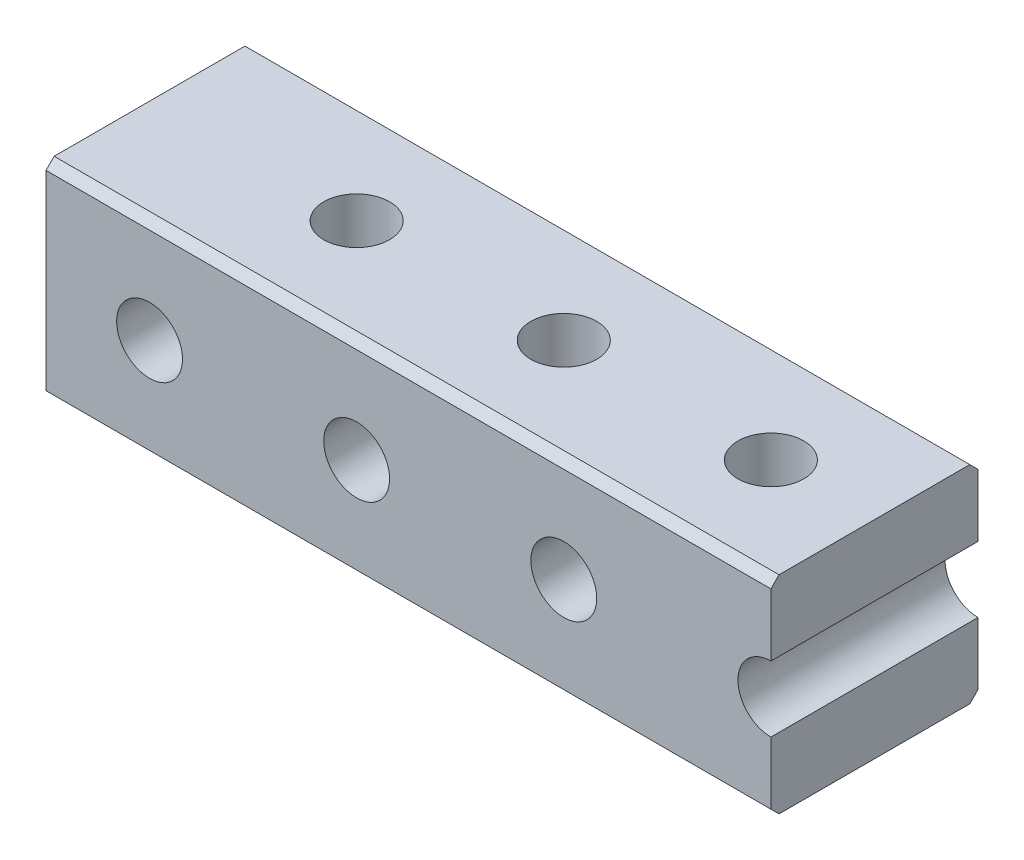
ISO-10303-21;
HEADER;
FILE_DESCRIPTION(('STEP AP214'),'2;1');
FILE_NAME('part.step','',(''),(''),'','','');
FILE_SCHEMA(('AUTOMOTIVE_DESIGN { 1 0 10303 214 1 1 1 1 }'));
ENDSEC;
DATA;
#1=APPLICATION_CONTEXT('core data for automotive mechanical design processes');
#2=APPLICATION_PROTOCOL_DEFINITION('international standard','automotive_design',2000,#1);
#3=PRODUCT_CONTEXT('',#1,'mechanical');
#4=PRODUCT('Part','Part','',(#3));
#5=PRODUCT_RELATED_PRODUCT_CATEGORY('part','',(#4));
#6=PRODUCT_DEFINITION_FORMATION('','',#4);
#7=PRODUCT_DEFINITION_CONTEXT('part definition',#1,'design');
#8=PRODUCT_DEFINITION('design','',#6,#7);
#9=PRODUCT_DEFINITION_SHAPE('','',#8);
#10=(LENGTH_UNIT() NAMED_UNIT(*) SI_UNIT(.MILLI.,.METRE.));
#11=(NAMED_UNIT(*) PLANE_ANGLE_UNIT() SI_UNIT($,.RADIAN.));
#12=(NAMED_UNIT(*) SI_UNIT($,.STERADIAN.) SOLID_ANGLE_UNIT());
#13=UNCERTAINTY_MEASURE_WITH_UNIT(LENGTH_MEASURE(1.E-05),#10,'distance_accuracy_value','');
#14=(GEOMETRIC_REPRESENTATION_CONTEXT(3) GLOBAL_UNCERTAINTY_ASSIGNED_CONTEXT((#13)) GLOBAL_UNIT_ASSIGNED_CONTEXT((#10,
#11,#12)) REPRESENTATION_CONTEXT('',''));
#15=CARTESIAN_POINT('',(0.,0.,0.));
#16=DIRECTION('',(0.,0.,1.));
#17=DIRECTION('',(1.,0.,0.));
#18=AXIS2_PLACEMENT_3D('',#15,#16,#17);
#19=CARTESIAN_POINT('',(22.225,0.,0.));
#20=DIRECTION('',(1.,0.,0.));
#21=DIRECTION('',(0.,1.,0.));
#22=AXIS2_PLACEMENT_3D('',#19,#20,#21);
#23=PLANE('',#22);
#24=DIRECTION('',(0.,0.,-1.));
#25=VECTOR('',#24,1.);
#26=CARTESIAN_POINT('',(22.225,-2.0193,6.35));
#27=LINE('',#26,#25);
#28=CARTESIAN_POINT('',(22.225,-2.0193,6.35));
#29=VERTEX_POINT('',#28);
#30=CARTESIAN_POINT('',(22.225,-2.0193,-6.35));
#31=VERTEX_POINT('',#30);
#32=EDGE_CURVE('E11',#29,#31,#27,.T.);
#33=ORIENTED_EDGE('',*,*,#32,.F.);
#34=DIRECTION('',(0.,1.,0.));
#35=VECTOR('',#34,1.);
#36=CARTESIAN_POINT('',(22.225,2.925,6.35));
#37=LINE('',#36,#35);
#38=CARTESIAN_POINT('',(22.225,-5.85,6.35));
#39=VERTEX_POINT('',#38);
#40=EDGE_CURVE('E204',#39,#29,#37,.T.);
#41=ORIENTED_EDGE('',*,*,#40,.F.);
#42=DIRECTION('',(0.,0.707106781186548,0.707106781186547));
#43=VECTOR('',#42,1.);
#44=CARTESIAN_POINT('',(22.225,-6.1,6.1));
#45=LINE('',#44,#43);
#46=CARTESIAN_POINT('',(22.225,-6.35,5.85));
#47=VERTEX_POINT('',#46);
#48=EDGE_CURVE('E200',#47,#39,#45,.T.);
#49=ORIENTED_EDGE('',*,*,#48,.F.);
#50=DIRECTION('',(0.,0.,1.));
#51=VECTOR('',#50,1.);
#52=CARTESIAN_POINT('',(22.225,-6.35,2.925));
#53=LINE('',#52,#51);
#54=CARTESIAN_POINT('',(22.225,-6.35,-5.85));
#55=VERTEX_POINT('',#54);
#56=EDGE_CURVE('E196',#55,#47,#53,.T.);
#57=ORIENTED_EDGE('',*,*,#56,.F.);
#58=DIRECTION('',(0.,-0.707106781186547,0.707106781186548));
#59=VECTOR('',#58,1.);
#60=CARTESIAN_POINT('',(22.225,-6.1,-6.1));
#61=LINE('',#60,#59);
#62=CARTESIAN_POINT('',(22.225,-5.85,-6.35));
#63=VERTEX_POINT('',#62);
#64=EDGE_CURVE('E192',#63,#55,#61,.T.);
#65=ORIENTED_EDGE('',*,*,#64,.F.);
#66=DIRECTION('',(0.,-1.,0.));
#67=VECTOR('',#66,1.);
#68=CARTESIAN_POINT('',(22.225,-2.925,-6.35));
#69=LINE('',#68,#67);
#70=EDGE_CURVE('E191',#31,#63,#69,.T.);
#71=ORIENTED_EDGE('',*,*,#70,.F.);
#72=EDGE_LOOP('',(#33,#41,#49,#57,#65,#71));
#73=FACE_BOUND('',#72,.T.);
#74=ADVANCED_FACE('F17',(#73),#23,.T.);
#75=CARTESIAN_POINT('',(130.175,6.1,-6.1));
#76=DIRECTION('',(0.,0.707106781186547,-0.707106781186548));
#77=DIRECTION('',(0.,0.707106781186548,0.707106781186547));
#78=AXIS2_PLACEMENT_3D('',#75,#76,#77);
#79=PLANE('',#78);
#80=DIRECTION('',(0.,-0.707106781186548,-0.707106781186547));
#81=VECTOR('',#80,1.);
#82=CARTESIAN_POINT('',(-22.225,6.1,-6.1));
#83=LINE('',#82,#81);
#84=CARTESIAN_POINT('',(-22.225,6.35,-5.85));
#85=VERTEX_POINT('',#84);
#86=CARTESIAN_POINT('',(-22.225,5.85,-6.35));
#87=VERTEX_POINT('',#86);
#88=EDGE_CURVE('E108',#85,#87,#83,.T.);
#89=ORIENTED_EDGE('',*,*,#88,.F.);
#90=DIRECTION('',(-1.,0.,0.));
#91=VECTOR('',#90,1.);
#92=CARTESIAN_POINT('',(130.175,6.35,-5.85));
#93=LINE('',#92,#91);
#94=CARTESIAN_POINT('',(22.225,6.35,-5.85));
#95=VERTEX_POINT('',#94);
#96=EDGE_CURVE('E93',#95,#85,#93,.T.);
#97=ORIENTED_EDGE('',*,*,#96,.F.);
#98=DIRECTION('',(0.,-0.707106781186548,-0.707106781186547));
#99=VECTOR('',#98,1.);
#100=CARTESIAN_POINT('',(22.225,6.1,-6.1));
#101=LINE('',#100,#99);
#102=CARTESIAN_POINT('',(22.225,5.85,-6.35));
#103=VERTEX_POINT('',#102);
#104=EDGE_CURVE('E148',#95,#103,#101,.T.);
#105=ORIENTED_EDGE('',*,*,#104,.T.);
#106=DIRECTION('',(-1.,0.,0.));
#107=VECTOR('',#106,1.);
#108=CARTESIAN_POINT('',(130.175,5.85,-6.35));
#109=LINE('',#108,#107);
#110=EDGE_CURVE('E110',#103,#87,#109,.T.);
#111=ORIENTED_EDGE('',*,*,#110,.T.);
#112=EDGE_LOOP('',(#89,#97,#105,#111));
#113=FACE_BOUND('',#112,.T.);
#114=ADVANCED_FACE('F109',(#113),#79,.T.);
#115=CARTESIAN_POINT('',(130.175,6.35,-2.925));
#116=DIRECTION('',(0.,1.,0.));
#117=DIRECTION('',(0.,0.,1.));
#118=AXIS2_PLACEMENT_3D('',#115,#116,#117);
#119=PLANE('',#118);
#120=CARTESIAN_POINT('',(-9.525,6.35,0.));
#121=DIRECTION('',(0.,1.,0.));
#122=DIRECTION('',(0.,0.,1.));
#123=AXIS2_PLACEMENT_3D('',#120,#121,#122);
#124=CIRCLE('',#123,2.0193);
#125=CARTESIAN_POINT('',(-9.525,6.35,2.0193));
#126=VERTEX_POINT('',#125);
#127=EDGE_CURVE('E115',#126,#126,#124,.F.);
#128=ORIENTED_EDGE('',*,*,#127,.T.);
#129=EDGE_LOOP('',(#128));
#130=FACE_BOUND('',#129,.T.);
#131=CARTESIAN_POINT('',(3.175,6.35,0.));
#132=DIRECTION('',(0.,1.,0.));
#133=DIRECTION('',(0.,0.,1.));
#134=AXIS2_PLACEMENT_3D('',#131,#132,#133);
#135=CIRCLE('',#134,2.0193);
#136=CARTESIAN_POINT('',(3.175,6.35,2.0193));
#137=VERTEX_POINT('',#136);
#138=EDGE_CURVE('E236',#137,#137,#135,.F.);
#139=ORIENTED_EDGE('',*,*,#138,.T.);
#140=EDGE_LOOP('',(#139));
#141=FACE_BOUND('',#140,.T.);
#142=CARTESIAN_POINT('',(15.875,6.35,0.));
#143=DIRECTION('',(0.,1.,0.));
#144=DIRECTION('',(0.,0.,1.));
#145=AXIS2_PLACEMENT_3D('',#142,#143,#144);
#146=CIRCLE('',#145,2.0193);
#147=CARTESIAN_POINT('',(15.875,6.35,2.0193));
#148=VERTEX_POINT('',#147);
#149=EDGE_CURVE('E233',#148,#148,#146,.F.);
#150=ORIENTED_EDGE('',*,*,#149,.T.);
#151=EDGE_LOOP('',(#150));
#152=FACE_BOUND('',#151,.T.);
#153=DIRECTION('',(0.,0.,-1.));
#154=VECTOR('',#153,1.);
#155=CARTESIAN_POINT('',(-22.225,6.35,-2.925));
#156=LINE('',#155,#154);
#157=CARTESIAN_POINT('',(-22.225,6.35,5.85));
#158=VERTEX_POINT('',#157);
#159=EDGE_CURVE('E97',#158,#85,#156,.T.);
#160=ORIENTED_EDGE('',*,*,#159,.F.);
#161=DIRECTION('',(-1.,0.,0.));
#162=VECTOR('',#161,1.);
#163=CARTESIAN_POINT('',(130.175,6.35,5.85));
#164=LINE('',#163,#162);
#165=CARTESIAN_POINT('',(22.225,6.35,5.85));
#166=VERTEX_POINT('',#165);
#167=EDGE_CURVE('E105',#166,#158,#164,.T.);
#168=ORIENTED_EDGE('',*,*,#167,.F.);
#169=DIRECTION('',(0.,0.,-1.));
#170=VECTOR('',#169,1.);
#171=CARTESIAN_POINT('',(22.225,6.35,-2.925));
#172=LINE('',#171,#170);
#173=EDGE_CURVE('E100',#166,#95,#172,.T.);
#174=ORIENTED_EDGE('',*,*,#173,.T.);
#175=ORIENTED_EDGE('',*,*,#96,.T.);
#176=EDGE_LOOP('',(#160,#168,#174,#175));
#177=FACE_BOUND('',#176,.T.);
#178=ADVANCED_FACE('F95',(#130,#141,#152,#177),#119,.T.);
#179=CARTESIAN_POINT('',(130.175,6.1,6.1));
#180=DIRECTION('',(0.,0.707106781186548,0.707106781186547));
#181=DIRECTION('',(0.,-0.707106781186547,0.707106781186548));
#182=AXIS2_PLACEMENT_3D('',#179,#180,#181);
#183=PLANE('',#182);
#184=DIRECTION('',(0.,0.707106781186547,-0.707106781186548));
#185=VECTOR('',#184,1.);
#186=CARTESIAN_POINT('',(-22.225,6.1,6.1));
#187=LINE('',#186,#185);
#188=CARTESIAN_POINT('',(-22.225,5.85,6.35));
#189=VERTEX_POINT('',#188);
#190=EDGE_CURVE('E120',#189,#158,#187,.T.);
#191=ORIENTED_EDGE('',*,*,#190,.F.);
#192=DIRECTION('',(-1.,0.,0.));
#193=VECTOR('',#192,1.);
#194=CARTESIAN_POINT('',(130.175,5.85,6.35));
#195=LINE('',#194,#193);
#196=CARTESIAN_POINT('',(22.225,5.85,6.35));
#197=VERTEX_POINT('',#196);
#198=EDGE_CURVE('E164',#197,#189,#195,.T.);
#199=ORIENTED_EDGE('',*,*,#198,.F.);
#200=DIRECTION('',(0.,0.707106781186547,-0.707106781186548));
#201=VECTOR('',#200,1.);
#202=CARTESIAN_POINT('',(22.225,6.1,6.1));
#203=LINE('',#202,#201);
#204=EDGE_CURVE('E209',#197,#166,#203,.T.);
#205=ORIENTED_EDGE('',*,*,#204,.T.);
#206=ORIENTED_EDGE('',*,*,#167,.T.);
#207=EDGE_LOOP('',(#191,#199,#205,#206));
#208=FACE_BOUND('',#207,.T.);
#209=ADVANCED_FACE('F224',(#208),#183,.T.);
#210=CARTESIAN_POINT('',(130.175,2.925,6.35));
#211=DIRECTION('',(0.,0.,1.));
#212=DIRECTION('',(1.,0.,0.));
#213=AXIS2_PLACEMENT_3D('',#210,#211,#212);
#214=PLANE('',#213);
#215=CARTESIAN_POINT('',(-15.875,0.,6.35));
#216=DIRECTION('',(0.,0.,-1.));
#217=DIRECTION('',(-1.,0.,0.));
#218=AXIS2_PLACEMENT_3D('',#215,#216,#217);
#219=CIRCLE('',#218,2.0193);
#220=CARTESIAN_POINT('',(-17.8943,0.,6.35));
#221=VERTEX_POINT('',#220);
#222=EDGE_CURVE('E173',#221,#221,#219,.T.);
#223=ORIENTED_EDGE('',*,*,#222,.T.);
#224=EDGE_LOOP('',(#223));
#225=FACE_BOUND('',#224,.T.);
#226=CARTESIAN_POINT('',(-3.175,0.,6.35));
#227=DIRECTION('',(0.,0.,-1.));
#228=DIRECTION('',(-1.,0.,0.));
#229=AXIS2_PLACEMENT_3D('',#226,#227,#228);
#230=CIRCLE('',#229,2.0193);
#231=CARTESIAN_POINT('',(-5.1943,0.,6.35));
#232=VERTEX_POINT('',#231);
#233=EDGE_CURVE('E262',#232,#232,#230,.T.);
#234=ORIENTED_EDGE('',*,*,#233,.T.);
#235=EDGE_LOOP('',(#234));
#236=FACE_BOUND('',#235,.T.);
#237=CARTESIAN_POINT('',(9.525,0.,6.35));
#238=DIRECTION('',(0.,0.,-1.));
#239=DIRECTION('',(-1.,0.,0.));
#240=AXIS2_PLACEMENT_3D('',#237,#238,#239);
#241=CIRCLE('',#240,2.0193);
#242=CARTESIAN_POINT('',(7.5057,0.,6.35));
#243=VERTEX_POINT('',#242);
#244=EDGE_CURVE('E258',#243,#243,#241,.T.);
#245=ORIENTED_EDGE('',*,*,#244,.T.);
#246=EDGE_LOOP('',(#245));
#247=FACE_BOUND('',#246,.T.);
#248=DIRECTION('',(0.,1.,0.));
#249=VECTOR('',#248,1.);
#250=CARTESIAN_POINT('',(-22.225,2.925,6.35));
#251=LINE('',#250,#249);
#252=CARTESIAN_POINT('',(-22.225,-5.85,6.35));
#253=VERTEX_POINT('',#252);
#254=EDGE_CURVE('E127',#253,#189,#251,.T.);
#255=ORIENTED_EDGE('',*,*,#254,.F.);
#256=DIRECTION('',(-1.,0.,0.));
#257=VECTOR('',#256,1.);
#258=CARTESIAN_POINT('',(130.175,-5.85,6.35));
#259=LINE('',#258,#257);
#260=EDGE_CURVE('E161',#39,#253,#259,.T.);
#261=ORIENTED_EDGE('',*,*,#260,.F.);
#262=ORIENTED_EDGE('',*,*,#40,.T.);
#263=CARTESIAN_POINT('',(22.225,0.,6.35));
#264=DIRECTION('',(0.,0.,-1.));
#265=DIRECTION('',(-1.,0.,0.));
#266=AXIS2_PLACEMENT_3D('',#263,#264,#265);
#267=CIRCLE('',#266,2.0193);
#268=CARTESIAN_POINT('',(22.225,2.0193,6.35));
#269=VERTEX_POINT('',#268);
#270=EDGE_CURVE('E228',#29,#269,#267,.T.);
#271=ORIENTED_EDGE('',*,*,#270,.T.);
#272=EDGE_CURVE('E208',#269,#197,#37,.T.);
#273=ORIENTED_EDGE('',*,*,#272,.T.);
#274=ORIENTED_EDGE('',*,*,#198,.T.);
#275=EDGE_LOOP('',(#255,#261,#262,#271,#273,#274));
#276=FACE_BOUND('',#275,.T.);
#277=ADVANCED_FACE('F227',(#225,#236,#247,#276),#214,.T.);
#278=CARTESIAN_POINT('',(130.175,-6.1,6.1));
#279=DIRECTION('',(0.,-0.707106781186547,0.707106781186548));
#280=DIRECTION('',(0.,-0.707106781186548,-0.707106781186547));
#281=AXIS2_PLACEMENT_3D('',#278,#279,#280);
#282=PLANE('',#281);
#283=DIRECTION('',(0.,0.707106781186548,0.707106781186547));
#284=VECTOR('',#283,1.);
#285=CARTESIAN_POINT('',(-22.225,-6.1,6.1));
#286=LINE('',#285,#284);
#287=CARTESIAN_POINT('',(-22.225,-6.35,5.85));
#288=VERTEX_POINT('',#287);
#289=EDGE_CURVE('E133',#288,#253,#286,.T.);
#290=ORIENTED_EDGE('',*,*,#289,.F.);
#291=DIRECTION('',(-1.,0.,0.));
#292=VECTOR('',#291,1.);
#293=CARTESIAN_POINT('',(130.175,-6.35,5.85));
#294=LINE('',#293,#292);
#295=EDGE_CURVE('E158',#47,#288,#294,.T.);
#296=ORIENTED_EDGE('',*,*,#295,.F.);
#297=ORIENTED_EDGE('',*,*,#48,.T.);
#298=ORIENTED_EDGE('',*,*,#260,.T.);
#299=EDGE_LOOP('',(#290,#296,#297,#298));
#300=FACE_BOUND('',#299,.T.);
#301=ADVANCED_FACE('F306',(#300),#282,.T.);
#302=CARTESIAN_POINT('',(130.175,-6.35,2.925));
#303=DIRECTION('',(0.,-1.,0.));
#304=DIRECTION('',(0.,0.,-1.));
#305=AXIS2_PLACEMENT_3D('',#302,#303,#304);
#306=PLANE('',#305);
#307=CARTESIAN_POINT('',(-9.525,-6.35,0.));
#308=DIRECTION('',(0.,1.,0.));
#309=DIRECTION('',(0.,0.,1.));
#310=AXIS2_PLACEMENT_3D('',#307,#308,#309);
#311=CIRCLE('',#310,2.0193);
#312=CARTESIAN_POINT('',(-9.525,-6.35,2.0193));
#313=VERTEX_POINT('',#312);
#314=EDGE_CURVE('E237',#313,#313,#311,.T.);
#315=ORIENTED_EDGE('',*,*,#314,.T.);
#316=EDGE_LOOP('',(#315));
#317=FACE_BOUND('',#316,.T.);
#318=CARTESIAN_POINT('',(3.175,-6.35,0.));
#319=DIRECTION('',(0.,1.,0.));
#320=DIRECTION('',(0.,0.,1.));
#321=AXIS2_PLACEMENT_3D('',#318,#319,#320);
#322=CIRCLE('',#321,2.0193);
#323=CARTESIAN_POINT('',(3.175,-6.35,2.0193));
#324=VERTEX_POINT('',#323);
#325=EDGE_CURVE('E249',#324,#324,#322,.T.);
#326=ORIENTED_EDGE('',*,*,#325,.T.);
#327=EDGE_LOOP('',(#326));
#328=FACE_BOUND('',#327,.T.);
#329=CARTESIAN_POINT('',(15.875,-6.35,0.));
#330=DIRECTION('',(0.,1.,0.));
#331=DIRECTION('',(0.,0.,1.));
#332=AXIS2_PLACEMENT_3D('',#329,#330,#331);
#333=CIRCLE('',#332,2.0193);
#334=CARTESIAN_POINT('',(15.875,-6.35,2.0193));
#335=VERTEX_POINT('',#334);
#336=EDGE_CURVE('E185',#335,#335,#333,.T.);
#337=ORIENTED_EDGE('',*,*,#336,.T.);
#338=EDGE_LOOP('',(#337));
#339=FACE_BOUND('',#338,.T.);
#340=DIRECTION('',(0.,0.,1.));
#341=VECTOR('',#340,1.);
#342=CARTESIAN_POINT('',(-22.225,-6.35,2.925));
#343=LINE('',#342,#341);
#344=CARTESIAN_POINT('',(-22.225,-6.35,-5.85));
#345=VERTEX_POINT('',#344);
#346=EDGE_CURVE('E137',#345,#288,#343,.T.);
#347=ORIENTED_EDGE('',*,*,#346,.F.);
#348=DIRECTION('',(-1.,0.,0.));
#349=VECTOR('',#348,1.);
#350=CARTESIAN_POINT('',(130.175,-6.35,-5.85));
#351=LINE('',#350,#349);
#352=EDGE_CURVE('E155',#55,#345,#351,.T.);
#353=ORIENTED_EDGE('',*,*,#352,.F.);
#354=ORIENTED_EDGE('',*,*,#56,.T.);
#355=ORIENTED_EDGE('',*,*,#295,.T.);
#356=EDGE_LOOP('',(#347,#353,#354,#355));
#357=FACE_BOUND('',#356,.T.);
#358=ADVANCED_FACE('F298',(#317,#328,#339,#357),#306,.T.);
#359=CARTESIAN_POINT('',(130.175,-6.1,-6.1));
#360=DIRECTION('',(0.,-0.707106781186548,-0.707106781186547));
#361=DIRECTION('',(0.,0.707106781186547,-0.707106781186548));
#362=AXIS2_PLACEMENT_3D('',#359,#360,#361);
#363=PLANE('',#362);
#364=DIRECTION('',(0.,-0.707106781186547,0.707106781186548));
#365=VECTOR('',#364,1.);
#366=CARTESIAN_POINT('',(-22.225,-6.1,-6.1));
#367=LINE('',#366,#365);
#368=CARTESIAN_POINT('',(-22.225,-5.85,-6.35));
#369=VERTEX_POINT('',#368);
#370=EDGE_CURVE('E141',#369,#345,#367,.T.);
#371=ORIENTED_EDGE('',*,*,#370,.F.);
#372=DIRECTION('',(-1.,0.,0.));
#373=VECTOR('',#372,1.);
#374=CARTESIAN_POINT('',(130.175,-5.85,-6.35));
#375=LINE('',#374,#373);
#376=EDGE_CURVE('E151',#63,#369,#375,.T.);
#377=ORIENTED_EDGE('',*,*,#376,.F.);
#378=ORIENTED_EDGE('',*,*,#64,.T.);
#379=ORIENTED_EDGE('',*,*,#352,.T.);
#380=EDGE_LOOP('',(#371,#377,#378,#379));
#381=FACE_BOUND('',#380,.T.);
#382=ADVANCED_FACE('F293',(#381),#363,.T.);
#383=CARTESIAN_POINT('',(130.175,-2.925,-6.35));
#384=DIRECTION('',(0.,0.,-1.));
#385=DIRECTION('',(-1.,0.,0.));
#386=AXIS2_PLACEMENT_3D('',#383,#384,#385);
#387=PLANE('',#386);
#388=CARTESIAN_POINT('',(-15.875,0.,-6.35));
#389=DIRECTION('',(0.,0.,-1.));
#390=DIRECTION('',(-1.,0.,0.));
#391=AXIS2_PLACEMENT_3D('',#388,#389,#390);
#392=CIRCLE('',#391,2.0193);
#393=CARTESIAN_POINT('',(-17.8943,0.,-6.35));
#394=VERTEX_POINT('',#393);
#395=EDGE_CURVE('E181',#394,#394,#392,.F.);
#396=ORIENTED_EDGE('',*,*,#395,.T.);
#397=EDGE_LOOP('',(#396));
#398=FACE_BOUND('',#397,.T.);
#399=CARTESIAN_POINT('',(-3.175,0.,-6.35));
#400=DIRECTION('',(0.,0.,-1.));
#401=DIRECTION('',(-1.,0.,0.));
#402=AXIS2_PLACEMENT_3D('',#399,#400,#401);
#403=CIRCLE('',#402,2.0193);
#404=CARTESIAN_POINT('',(-5.1943,0.,-6.35));
#405=VERTEX_POINT('',#404);
#406=EDGE_CURVE('E177',#405,#405,#403,.F.);
#407=ORIENTED_EDGE('',*,*,#406,.T.);
#408=EDGE_LOOP('',(#407));
#409=FACE_BOUND('',#408,.T.);
#410=CARTESIAN_POINT('',(9.525,0.,-6.35));
#411=DIRECTION('',(0.,0.,-1.));
#412=DIRECTION('',(-1.,0.,0.));
#413=AXIS2_PLACEMENT_3D('',#410,#411,#412);
#414=CIRCLE('',#413,2.0193);
#415=CARTESIAN_POINT('',(7.5057,0.,-6.35));
#416=VERTEX_POINT('',#415);
#417=EDGE_CURVE('E172',#416,#416,#414,.F.);
#418=ORIENTED_EDGE('',*,*,#417,.T.);
#419=EDGE_LOOP('',(#418));
#420=FACE_BOUND('',#419,.T.);
#421=DIRECTION('',(0.,-1.,0.));
#422=VECTOR('',#421,1.);
#423=CARTESIAN_POINT('',(-22.225,-2.925,-6.35));
#424=LINE('',#423,#422);
#425=EDGE_CURVE('E145',#87,#369,#424,.T.);
#426=ORIENTED_EDGE('',*,*,#425,.F.);
#427=ORIENTED_EDGE('',*,*,#110,.F.);
#428=CARTESIAN_POINT('',(22.225,2.0193,-6.35));
#429=VERTEX_POINT('',#428);
#430=EDGE_CURVE('E152',#103,#429,#69,.T.);
#431=ORIENTED_EDGE('',*,*,#430,.T.);
#432=CARTESIAN_POINT('',(22.225,0.,-6.35));
#433=DIRECTION('',(0.,0.,-1.));
#434=DIRECTION('',(-1.,0.,0.));
#435=AXIS2_PLACEMENT_3D('',#432,#433,#434);
#436=CIRCLE('',#435,2.0193);
#437=EDGE_CURVE('E169',#429,#31,#436,.F.);
#438=ORIENTED_EDGE('',*,*,#437,.T.);
#439=ORIENTED_EDGE('',*,*,#70,.T.);
#440=ORIENTED_EDGE('',*,*,#376,.T.);
#441=EDGE_LOOP('',(#426,#427,#431,#438,#439,#440));
#442=FACE_BOUND('',#441,.T.);
#443=ADVANCED_FACE('F221',(#398,#409,#420,#442),#387,.T.);
#444=ORIENTED_EDGE('',*,*,#272,.F.);
#445=DIRECTION('',(0.,0.,-1.));
#446=VECTOR('',#445,1.);
#447=CARTESIAN_POINT('',(22.225,2.0193,6.35));
#448=LINE('',#447,#446);
#449=EDGE_CURVE('E26',#269,#429,#448,.T.);
#450=ORIENTED_EDGE('',*,*,#449,.T.);
#451=ORIENTED_EDGE('',*,*,#430,.F.);
#452=ORIENTED_EDGE('',*,*,#104,.F.);
#453=ORIENTED_EDGE('',*,*,#173,.F.);
#454=ORIENTED_EDGE('',*,*,#204,.F.);
#455=EDGE_LOOP('',(#444,#450,#451,#452,#453,#454));
#456=FACE_BOUND('',#455,.T.);
#457=ADVANCED_FACE('F19',(#456),#23,.T.);
#458=CARTESIAN_POINT('',(-22.225,0.,0.));
#459=DIRECTION('',(1.,0.,0.));
#460=DIRECTION('',(0.,1.,0.));
#461=AXIS2_PLACEMENT_3D('',#458,#459,#460);
#462=PLANE('',#461);
#463=ORIENTED_EDGE('',*,*,#88,.T.);
#464=ORIENTED_EDGE('',*,*,#425,.T.);
#465=ORIENTED_EDGE('',*,*,#370,.T.);
#466=ORIENTED_EDGE('',*,*,#346,.T.);
#467=ORIENTED_EDGE('',*,*,#289,.T.);
#468=ORIENTED_EDGE('',*,*,#254,.T.);
#469=ORIENTED_EDGE('',*,*,#190,.T.);
#470=ORIENTED_EDGE('',*,*,#159,.T.);
#471=EDGE_LOOP('',(#463,#464,#465,#466,#467,#468,#469,#470));
#472=FACE_BOUND('',#471,.T.);
#473=ADVANCED_FACE('F117',(#472),#462,.F.);
#474=CARTESIAN_POINT('',(15.875,-6.35,0.));
#475=DIRECTION('',(0.,1.,0.));
#476=DIRECTION('',(0.,0.,1.));
#477=AXIS2_PLACEMENT_3D('',#474,#475,#476);
#478=CYLINDRICAL_SURFACE('',#477,2.0193);
#479=ORIENTED_EDGE('',*,*,#149,.F.);
#480=EDGE_LOOP('',(#479));
#481=FACE_BOUND('',#480,.T.);
#482=ORIENTED_EDGE('',*,*,#336,.F.);
#483=EDGE_LOOP('',(#482));
#484=FACE_BOUND('',#483,.T.);
#485=ADVANCED_FACE('F291',(#481,#484),#478,.F.);
#486=CARTESIAN_POINT('',(3.175,-6.35,0.));
#487=DIRECTION('',(0.,1.,0.));
#488=DIRECTION('',(0.,0.,1.));
#489=AXIS2_PLACEMENT_3D('',#486,#487,#488);
#490=CYLINDRICAL_SURFACE('',#489,2.0193);
#491=ORIENTED_EDGE('',*,*,#138,.F.);
#492=EDGE_LOOP('',(#491));
#493=FACE_BOUND('',#492,.T.);
#494=ORIENTED_EDGE('',*,*,#325,.F.);
#495=EDGE_LOOP('',(#494));
#496=FACE_BOUND('',#495,.T.);
#497=ADVANCED_FACE('F324',(#493,#496),#490,.F.);
#498=CARTESIAN_POINT('',(-9.525,-6.35,0.));
#499=DIRECTION('',(0.,1.,0.));
#500=DIRECTION('',(0.,0.,1.));
#501=AXIS2_PLACEMENT_3D('',#498,#499,#500);
#502=CYLINDRICAL_SURFACE('',#501,2.0193);
#503=ORIENTED_EDGE('',*,*,#127,.F.);
#504=EDGE_LOOP('',(#503));
#505=FACE_BOUND('',#504,.T.);
#506=ORIENTED_EDGE('',*,*,#314,.F.);
#507=EDGE_LOOP('',(#506));
#508=FACE_BOUND('',#507,.T.);
#509=ADVANCED_FACE('F337',(#505,#508),#502,.F.);
#510=CARTESIAN_POINT('',(22.225,0.,6.35));
#511=DIRECTION('',(0.,0.,-1.));
#512=DIRECTION('',(-1.,0.,0.));
#513=AXIS2_PLACEMENT_3D('',#510,#511,#512);
#514=CYLINDRICAL_SURFACE('',#513,2.0193);
#515=ORIENTED_EDGE('',*,*,#270,.F.);
#516=ORIENTED_EDGE('',*,*,#32,.T.);
#517=ORIENTED_EDGE('',*,*,#437,.F.);
#518=ORIENTED_EDGE('',*,*,#449,.F.);
#519=EDGE_LOOP('',(#515,#516,#517,#518));
#520=FACE_BOUND('',#519,.T.);
#521=ADVANCED_FACE('F219',(#520),#514,.F.);
#522=CARTESIAN_POINT('',(9.525,0.,6.35));
#523=DIRECTION('',(0.,0.,-1.));
#524=DIRECTION('',(-1.,0.,0.));
#525=AXIS2_PLACEMENT_3D('',#522,#523,#524);
#526=CYLINDRICAL_SURFACE('',#525,2.0193);
#527=ORIENTED_EDGE('',*,*,#417,.F.);
#528=EDGE_LOOP('',(#527));
#529=FACE_BOUND('',#528,.T.);
#530=ORIENTED_EDGE('',*,*,#244,.F.);
#531=EDGE_LOOP('',(#530));
#532=FACE_BOUND('',#531,.T.);
#533=ADVANCED_FACE('F280',(#529,#532),#526,.F.);
#534=CARTESIAN_POINT('',(-3.175,0.,6.35));
#535=DIRECTION('',(0.,0.,-1.));
#536=DIRECTION('',(-1.,0.,0.));
#537=AXIS2_PLACEMENT_3D('',#534,#535,#536);
#538=CYLINDRICAL_SURFACE('',#537,2.0193);
#539=ORIENTED_EDGE('',*,*,#406,.F.);
#540=EDGE_LOOP('',(#539));
#541=FACE_BOUND('',#540,.T.);
#542=ORIENTED_EDGE('',*,*,#233,.F.);
#543=EDGE_LOOP('',(#542));
#544=FACE_BOUND('',#543,.T.);
#545=ADVANCED_FACE('F274',(#541,#544),#538,.F.);
#546=CARTESIAN_POINT('',(-15.875,0.,6.35));
#547=DIRECTION('',(0.,0.,-1.));
#548=DIRECTION('',(-1.,0.,0.));
#549=AXIS2_PLACEMENT_3D('',#546,#547,#548);
#550=CYLINDRICAL_SURFACE('',#549,2.0193);
#551=ORIENTED_EDGE('',*,*,#395,.F.);
#552=EDGE_LOOP('',(#551));
#553=FACE_BOUND('',#552,.T.);
#554=ORIENTED_EDGE('',*,*,#222,.F.);
#555=EDGE_LOOP('',(#554));
#556=FACE_BOUND('',#555,.T.);
#557=ADVANCED_FACE('F272',(#553,#556),#550,.F.);
#558=CLOSED_SHELL('',(#74,#114,#178,#209,#277,#301,#358,#382,#443,#457,#473,#485,#497,#509,#521,
#533,#545,#557));
#559=MANIFOLD_SOLID_BREP('B1',#558);
#560=ADVANCED_BREP_SHAPE_REPRESENTATION('',(#18,#559),#14);
#561=SHAPE_DEFINITION_REPRESENTATION(#9,#560);
ENDSEC;
END-ISO-10303-21;
